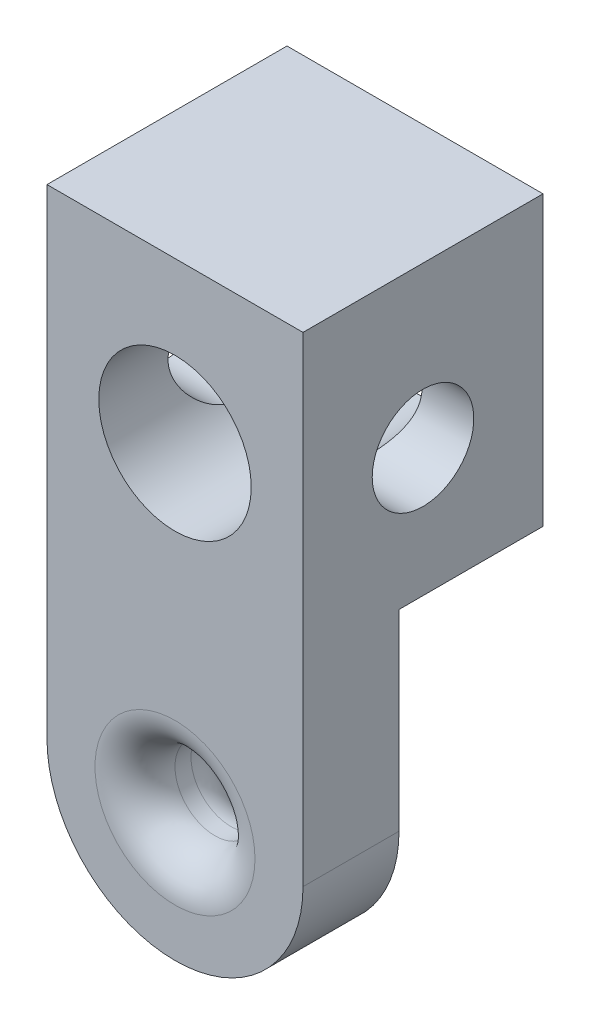
ISO-10303-21;
HEADER;
FILE_DESCRIPTION(('STEP AP214'),'2;1');
FILE_NAME('part.step','',(''),(''),'','','');
FILE_SCHEMA(('AUTOMOTIVE_DESIGN { 1 0 10303 214 1 1 1 1 }'));
ENDSEC;
DATA;
#1=APPLICATION_CONTEXT('core data for automotive mechanical design processes');
#2=APPLICATION_PROTOCOL_DEFINITION('international standard','automotive_design',2000,#1);
#3=PRODUCT_CONTEXT('',#1,'mechanical');
#4=PRODUCT('Part','Part','',(#3));
#5=PRODUCT_RELATED_PRODUCT_CATEGORY('part','',(#4));
#6=PRODUCT_DEFINITION_FORMATION('','',#4);
#7=PRODUCT_DEFINITION_CONTEXT('part definition',#1,'design');
#8=PRODUCT_DEFINITION('design','',#6,#7);
#9=PRODUCT_DEFINITION_SHAPE('','',#8);
#10=(LENGTH_UNIT() NAMED_UNIT(*) SI_UNIT(.MILLI.,.METRE.));
#11=(NAMED_UNIT(*) PLANE_ANGLE_UNIT() SI_UNIT($,.RADIAN.));
#12=(NAMED_UNIT(*) SI_UNIT($,.STERADIAN.) SOLID_ANGLE_UNIT());
#13=UNCERTAINTY_MEASURE_WITH_UNIT(LENGTH_MEASURE(1.E-05),#10,'distance_accuracy_value','');
#14=(GEOMETRIC_REPRESENTATION_CONTEXT(3) GLOBAL_UNCERTAINTY_ASSIGNED_CONTEXT((#13)) GLOBAL_UNIT_ASSIGNED_CONTEXT((#10,
#11,#12)) REPRESENTATION_CONTEXT('',''));
#15=CARTESIAN_POINT('',(0.,0.,0.));
#16=DIRECTION('',(0.,0.,1.));
#17=DIRECTION('',(1.,0.,0.));
#18=AXIS2_PLACEMENT_3D('',#15,#16,#17);
#19=CARTESIAN_POINT('',(0.,0.,0.));
#20=DIRECTION('',(0.,0.,1.));
#21=DIRECTION('',(1.,0.,0.));
#22=AXIS2_PLACEMENT_3D('',#19,#20,#21);
#23=PLANE('',#22);
#24=CARTESIAN_POINT('',(0.,20.,0.));
#25=DIRECTION('',(0.,0.,1.));
#26=DIRECTION('',(1.,0.,0.));
#27=AXIS2_PLACEMENT_3D('',#24,#25,#26);
#28=CIRCLE('',#27,4.7625);
#29=CARTESIAN_POINT('',(4.7625,20.,0.));
#30=VERTEX_POINT('',#29);
#31=EDGE_CURVE('E126',#30,#30,#28,.T.);
#32=ORIENTED_EDGE('',*,*,#31,.T.);
#33=EDGE_LOOP('',(#32));
#34=FACE_BOUND('',#33,.T.);
#35=DIRECTION('',(-1.,0.,0.));
#36=VECTOR('',#35,1.);
#37=CARTESIAN_POINT('',(8.,12.,0.));
#38=LINE('',#37,#36);
#39=CARTESIAN_POINT('',(8.,12.,0.));
#40=VERTEX_POINT('',#39);
#41=CARTESIAN_POINT('',(-8.,12.,0.));
#42=VERTEX_POINT('',#41);
#43=EDGE_CURVE('E118',#40,#42,#38,.T.);
#44=ORIENTED_EDGE('',*,*,#43,.T.);
#45=DIRECTION('',(0.,-1.,0.));
#46=VECTOR('',#45,1.);
#47=CARTESIAN_POINT('',(-8.,12.,0.));
#48=LINE('',#47,#46);
#49=CARTESIAN_POINT('',(-8.,30.,0.));
#50=VERTEX_POINT('',#49);
#51=EDGE_CURVE('E84',#50,#42,#48,.T.);
#52=ORIENTED_EDGE('',*,*,#51,.F.);
#53=DIRECTION('',(-1.,0.,0.));
#54=VECTOR('',#53,1.);
#55=CARTESIAN_POINT('',(8.,30.,0.));
#56=LINE('',#55,#54);
#57=CARTESIAN_POINT('',(8.,30.,0.));
#58=VERTEX_POINT('',#57);
#59=EDGE_CURVE('E143',#58,#50,#56,.T.);
#60=ORIENTED_EDGE('',*,*,#59,.F.);
#61=DIRECTION('',(0.,1.,0.));
#62=VECTOR('',#61,1.);
#63=CARTESIAN_POINT('',(8.,12.,0.));
#64=LINE('',#63,#62);
#65=EDGE_CURVE('E134',#40,#58,#64,.T.);
#66=ORIENTED_EDGE('',*,*,#65,.F.);
#67=EDGE_LOOP('',(#44,#52,#60,#66));
#68=FACE_BOUND('',#67,.T.);
#69=ADVANCED_FACE('F37',(#34,#68),#23,.F.);
#70=CARTESIAN_POINT('',(0.,0.,15.));
#71=DIRECTION('',(0.,0.,-1.));
#72=DIRECTION('',(-1.,0.,0.));
#73=AXIS2_PLACEMENT_3D('',#70,#71,#72);
#74=CYLINDRICAL_SURFACE('',#73,8.);
#75=CARTESIAN_POINT('',(0.,0.,9.));
#76=DIRECTION('',(0.,0.,-1.));
#77=DIRECTION('',(-1.,0.,0.));
#78=AXIS2_PLACEMENT_3D('',#75,#76,#77);
#79=CIRCLE('',#78,8.);
#80=CARTESIAN_POINT('',(8.,0.,9.));
#81=VERTEX_POINT('',#80);
#82=CARTESIAN_POINT('',(-8.,0.,9.));
#83=VERTEX_POINT('',#82);
#84=EDGE_CURVE('E59',#81,#83,#79,.T.);
#85=ORIENTED_EDGE('',*,*,#84,.F.);
#86=DIRECTION('',(0.,0.,-1.));
#87=VECTOR('',#86,1.);
#88=CARTESIAN_POINT('',(8.,0.,15.));
#89=LINE('',#88,#87);
#90=CARTESIAN_POINT('',(8.,0.,15.));
#91=VERTEX_POINT('',#90);
#92=EDGE_CURVE('E124',#91,#81,#89,.T.);
#93=ORIENTED_EDGE('',*,*,#92,.F.);
#94=CARTESIAN_POINT('',(0.,0.,15.));
#95=DIRECTION('',(0.,0.,1.));
#96=DIRECTION('',(1.,0.,0.));
#97=AXIS2_PLACEMENT_3D('',#94,#95,#96);
#98=CIRCLE('',#97,8.);
#99=CARTESIAN_POINT('',(-8.,0.,15.));
#100=VERTEX_POINT('',#99);
#101=EDGE_CURVE('E135',#100,#91,#98,.T.);
#102=ORIENTED_EDGE('',*,*,#101,.F.);
#103=DIRECTION('',(0.,0.,-1.));
#104=VECTOR('',#103,1.);
#105=CARTESIAN_POINT('',(-8.,0.,15.));
#106=LINE('',#105,#104);
#107=EDGE_CURVE('E141',#100,#83,#106,.T.);
#108=ORIENTED_EDGE('',*,*,#107,.T.);
#109=EDGE_LOOP('',(#85,#93,#102,#108));
#110=FACE_BOUND('',#109,.T.);
#111=ADVANCED_FACE('F184',(#110),#74,.T.);
#112=CARTESIAN_POINT('',(8.,12.,15.));
#113=DIRECTION('',(-1.,0.,0.));
#114=DIRECTION('',(0.,-1.,0.));
#115=AXIS2_PLACEMENT_3D('',#112,#113,#114);
#116=PLANE('',#115);
#117=CARTESIAN_POINT('',(8.00000000000001,20.,7.5));
#118=DIRECTION('',(-1.,0.,0.));
#119=DIRECTION('',(0.,0.,1.));
#120=AXIS2_PLACEMENT_3D('',#117,#118,#119);
#121=CIRCLE('',#120,3.175);
#122=CARTESIAN_POINT('',(8.00000000000001,20.,10.675));
#123=VERTEX_POINT('',#122);
#124=EDGE_CURVE('E167',#123,#123,#121,.T.);
#125=ORIENTED_EDGE('',*,*,#124,.T.);
#126=EDGE_LOOP('',(#125));
#127=FACE_BOUND('',#126,.T.);
#128=DIRECTION('',(0.,0.,-1.));
#129=VECTOR('',#128,1.);
#130=CARTESIAN_POINT('',(8.,12.,9.));
#131=LINE('',#130,#129);
#132=CARTESIAN_POINT('',(8.,12.,9.));
#133=VERTEX_POINT('',#132);
#134=EDGE_CURVE('E116',#133,#40,#131,.T.);
#135=ORIENTED_EDGE('',*,*,#134,.T.);
#136=ORIENTED_EDGE('',*,*,#65,.T.);
#137=DIRECTION('',(0.,0.,-1.));
#138=VECTOR('',#137,1.);
#139=CARTESIAN_POINT('',(8.,30.,15.));
#140=LINE('',#139,#138);
#141=CARTESIAN_POINT('',(8.,30.,15.));
#142=VERTEX_POINT('',#141);
#143=EDGE_CURVE('E151',#142,#58,#140,.T.);
#144=ORIENTED_EDGE('',*,*,#143,.F.);
#145=DIRECTION('',(0.,1.,0.));
#146=VECTOR('',#145,1.);
#147=CARTESIAN_POINT('',(8.,12.,15.));
#148=LINE('',#147,#146);
#149=EDGE_CURVE('E92',#91,#142,#148,.T.);
#150=ORIENTED_EDGE('',*,*,#149,.F.);
#151=ORIENTED_EDGE('',*,*,#92,.T.);
#152=DIRECTION('',(0.,1.,0.));
#153=VECTOR('',#152,1.);
#154=CARTESIAN_POINT('',(8.,12.,9.));
#155=LINE('',#154,#153);
#156=EDGE_CURVE('E110',#81,#133,#155,.T.);
#157=ORIENTED_EDGE('',*,*,#156,.T.);
#158=EDGE_LOOP('',(#135,#136,#144,#150,#151,#157));
#159=FACE_BOUND('',#158,.T.);
#160=ADVANCED_FACE('F122',(#127,#159),#116,.F.);
#161=CARTESIAN_POINT('',(-8.,12.,15.));
#162=DIRECTION('',(1.,0.,0.));
#163=DIRECTION('',(0.,1.,0.));
#164=AXIS2_PLACEMENT_3D('',#161,#162,#163);
#165=PLANE('',#164);
#166=CARTESIAN_POINT('',(-8.,20.,7.5));
#167=DIRECTION('',(-1.,0.,0.));
#168=DIRECTION('',(0.,0.,1.));
#169=AXIS2_PLACEMENT_3D('',#166,#167,#168);
#170=CIRCLE('',#169,3.17499999999999);
#171=CARTESIAN_POINT('',(-8.,20.,10.675));
#172=VERTEX_POINT('',#171);
#173=EDGE_CURVE('E325',#172,#172,#170,.T.);
#174=ORIENTED_EDGE('',*,*,#173,.F.);
#175=EDGE_LOOP('',(#174));
#176=FACE_BOUND('',#175,.T.);
#177=DIRECTION('',(0.,0.,-1.));
#178=VECTOR('',#177,1.);
#179=CARTESIAN_POINT('',(-8.,12.,9.));
#180=LINE('',#179,#178);
#181=CARTESIAN_POINT('',(-8.,12.,9.));
#182=VERTEX_POINT('',#181);
#183=EDGE_CURVE('E120',#182,#42,#180,.T.);
#184=ORIENTED_EDGE('',*,*,#183,.F.);
#185=DIRECTION('',(0.,-1.,0.));
#186=VECTOR('',#185,1.);
#187=CARTESIAN_POINT('',(-8.,12.,9.));
#188=LINE('',#187,#186);
#189=EDGE_CURVE('E111',#182,#83,#188,.T.);
#190=ORIENTED_EDGE('',*,*,#189,.T.);
#191=ORIENTED_EDGE('',*,*,#107,.F.);
#192=DIRECTION('',(0.,-1.,0.));
#193=VECTOR('',#192,1.);
#194=CARTESIAN_POINT('',(-8.,30.,15.));
#195=LINE('',#194,#193);
#196=CARTESIAN_POINT('',(-8.,30.,15.));
#197=VERTEX_POINT('',#196);
#198=EDGE_CURVE('E68',#197,#100,#195,.T.);
#199=ORIENTED_EDGE('',*,*,#198,.F.);
#200=DIRECTION('',(0.,0.,-1.));
#201=VECTOR('',#200,1.);
#202=CARTESIAN_POINT('',(-8.,30.,15.));
#203=LINE('',#202,#201);
#204=EDGE_CURVE('E148',#197,#50,#203,.T.);
#205=ORIENTED_EDGE('',*,*,#204,.T.);
#206=ORIENTED_EDGE('',*,*,#51,.T.);
#207=EDGE_LOOP('',(#184,#190,#191,#199,#205,#206));
#208=FACE_BOUND('',#207,.T.);
#209=ADVANCED_FACE('F197',(#176,#208),#165,.F.);
#210=CARTESIAN_POINT('',(0.,0.,15.));
#211=DIRECTION('',(0.,0.,-1.));
#212=DIRECTION('',(-1.,0.,0.));
#213=AXIS2_PLACEMENT_3D('',#210,#211,#212);
#214=CYLINDRICAL_SURFACE('',#213,2.5);
#215=CARTESIAN_POINT('',(0.,0.,12.5));
#216=DIRECTION('',(0.,0.,1.));
#217=DIRECTION('',(1.,0.,0.));
#218=AXIS2_PLACEMENT_3D('',#215,#216,#217);
#219=CIRCLE('',#218,2.5);
#220=CARTESIAN_POINT('',(2.5,0.,12.5));
#221=VERTEX_POINT('',#220);
#222=EDGE_CURVE('E158',#221,#221,#219,.T.);
#223=ORIENTED_EDGE('',*,*,#222,.T.);
#224=EDGE_LOOP('',(#223));
#225=FACE_BOUND('',#224,.T.);
#226=CARTESIAN_POINT('',(0.,0.,11.5));
#227=DIRECTION('',(0.,0.,-1.));
#228=DIRECTION('',(-1.,0.,0.));
#229=AXIS2_PLACEMENT_3D('',#226,#227,#228);
#230=CIRCLE('',#229,2.5);
#231=CARTESIAN_POINT('',(-2.5,0.,11.5));
#232=VERTEX_POINT('',#231);
#233=EDGE_CURVE('E155',#232,#232,#230,.T.);
#234=ORIENTED_EDGE('',*,*,#233,.T.);
#235=EDGE_LOOP('',(#234));
#236=FACE_BOUND('',#235,.T.);
#237=ADVANCED_FACE('F200',(#225,#236),#214,.F.);
#238=CARTESIAN_POINT('',(0.,0.,15.));
#239=DIRECTION('',(0.,0.,1.));
#240=DIRECTION('',(1.,0.,0.));
#241=AXIS2_PLACEMENT_3D('',#238,#239,#240);
#242=PLANE('',#241);
#243=CARTESIAN_POINT('',(0.,20.,15.));
#244=DIRECTION('',(0.,0.,1.));
#245=DIRECTION('',(1.,0.,0.));
#246=AXIS2_PLACEMENT_3D('',#243,#244,#245);
#247=CIRCLE('',#246,4.76249999999999);
#248=CARTESIAN_POINT('',(4.76249999999999,20.,15.));
#249=VERTEX_POINT('',#248);
#250=EDGE_CURVE('E321',#249,#249,#247,.T.);
#251=ORIENTED_EDGE('',*,*,#250,.F.);
#252=EDGE_LOOP('',(#251));
#253=FACE_BOUND('',#252,.T.);
#254=CARTESIAN_POINT('',(0.,0.,15.));
#255=DIRECTION('',(0.,0.,1.));
#256=DIRECTION('',(1.,0.,0.));
#257=AXIS2_PLACEMENT_3D('',#254,#255,#256);
#258=CIRCLE('',#257,5.);
#259=CARTESIAN_POINT('',(5.,0.,15.));
#260=VERTEX_POINT('',#259);
#261=EDGE_CURVE('E51',#260,#260,#258,.F.);
#262=ORIENTED_EDGE('',*,*,#261,.T.);
#263=EDGE_LOOP('',(#262));
#264=FACE_BOUND('',#263,.T.);
#265=ORIENTED_EDGE('',*,*,#101,.T.);
#266=ORIENTED_EDGE('',*,*,#149,.T.);
#267=DIRECTION('',(-1.,0.,0.));
#268=VECTOR('',#267,1.);
#269=CARTESIAN_POINT('',(8.,30.,15.));
#270=LINE('',#269,#268);
#271=EDGE_CURVE('E138',#142,#197,#270,.T.);
#272=ORIENTED_EDGE('',*,*,#271,.T.);
#273=ORIENTED_EDGE('',*,*,#198,.T.);
#274=EDGE_LOOP('',(#265,#266,#272,#273));
#275=FACE_BOUND('',#274,.T.);
#276=ADVANCED_FACE('F195',(#253,#264,#275),#242,.T.);
#277=CARTESIAN_POINT('',(8.,30.,15.));
#278=DIRECTION('',(0.,-1.,0.));
#279=DIRECTION('',(1.,0.,0.));
#280=AXIS2_PLACEMENT_3D('',#277,#278,#279);
#281=PLANE('',#280);
#282=ORIENTED_EDGE('',*,*,#59,.T.);
#283=ORIENTED_EDGE('',*,*,#204,.F.);
#284=ORIENTED_EDGE('',*,*,#271,.F.);
#285=ORIENTED_EDGE('',*,*,#143,.T.);
#286=EDGE_LOOP('',(#282,#283,#284,#285));
#287=FACE_BOUND('',#286,.T.);
#288=ADVANCED_FACE('F202',(#287),#281,.F.);
#289=CARTESIAN_POINT('',(0.,0.,9.));
#290=DIRECTION('',(0.,0.,-1.));
#291=DIRECTION('',(-1.,0.,0.));
#292=AXIS2_PLACEMENT_3D('',#289,#290,#291);
#293=PLANE('',#292);
#294=CARTESIAN_POINT('',(0.,0.,9.));
#295=DIRECTION('',(0.,0.,-1.));
#296=DIRECTION('',(-1.,0.,0.));
#297=AXIS2_PLACEMENT_3D('',#294,#295,#296);
#298=CIRCLE('',#297,5.);
#299=CARTESIAN_POINT('',(-5.,0.,9.));
#300=VERTEX_POINT('',#299);
#301=EDGE_CURVE('E11',#300,#300,#298,.F.);
#302=ORIENTED_EDGE('',*,*,#301,.T.);
#303=EDGE_LOOP('',(#302));
#304=FACE_BOUND('',#303,.T.);
#305=ORIENTED_EDGE('',*,*,#84,.T.);
#306=ORIENTED_EDGE('',*,*,#189,.F.);
#307=DIRECTION('',(-1.,0.,0.));
#308=VECTOR('',#307,1.);
#309=CARTESIAN_POINT('',(8.,12.,9.));
#310=LINE('',#309,#308);
#311=EDGE_CURVE('E106',#133,#182,#310,.T.);
#312=ORIENTED_EDGE('',*,*,#311,.F.);
#313=ORIENTED_EDGE('',*,*,#156,.F.);
#314=EDGE_LOOP('',(#305,#306,#312,#313));
#315=FACE_BOUND('',#314,.T.);
#316=ADVANCED_FACE('F108',(#304,#315),#293,.T.);
#317=CARTESIAN_POINT('',(8.,12.,9.));
#318=DIRECTION('',(0.,-1.,0.));
#319=DIRECTION('',(1.,0.,0.));
#320=AXIS2_PLACEMENT_3D('',#317,#318,#319);
#321=PLANE('',#320);
#322=ORIENTED_EDGE('',*,*,#43,.F.);
#323=ORIENTED_EDGE('',*,*,#134,.F.);
#324=ORIENTED_EDGE('',*,*,#311,.T.);
#325=ORIENTED_EDGE('',*,*,#183,.T.);
#326=EDGE_LOOP('',(#322,#323,#324,#325));
#327=FACE_BOUND('',#326,.T.);
#328=ADVANCED_FACE('F117',(#327),#321,.T.);
#329=CARTESIAN_POINT('',(0.,0.,12.5));
#330=DIRECTION('',(0.,0.,1.));
#331=DIRECTION('',(1.,0.,0.));
#332=AXIS2_PLACEMENT_3D('',#329,#330,#331);
#333=TOROIDAL_SURFACE('',#332,5.,2.5);
#334=ORIENTED_EDGE('',*,*,#261,.F.);
#335=EDGE_LOOP('',(#334));
#336=FACE_BOUND('',#335,.T.);
#337=ORIENTED_EDGE('',*,*,#222,.F.);
#338=EDGE_LOOP('',(#337));
#339=FACE_BOUND('',#338,.T.);
#340=ADVANCED_FACE('F208',(#336,#339),#333,.T.);
#341=CARTESIAN_POINT('',(0.,0.,11.5));
#342=DIRECTION('',(0.,0.,-1.));
#343=DIRECTION('',(-1.,0.,0.));
#344=AXIS2_PLACEMENT_3D('',#341,#342,#343);
#345=TOROIDAL_SURFACE('',#344,5.,2.5);
#346=ORIENTED_EDGE('',*,*,#301,.F.);
#347=EDGE_LOOP('',(#346));
#348=FACE_BOUND('',#347,.T.);
#349=ORIENTED_EDGE('',*,*,#233,.F.);
#350=EDGE_LOOP('',(#349));
#351=FACE_BOUND('',#350,.T.);
#352=ADVANCED_FACE('F39',(#348,#351),#345,.T.);
#353=CARTESIAN_POINT('',(0.,20.,15.));
#354=DIRECTION('',(0.,0.,1.));
#355=DIRECTION('',(1.,0.,0.));
#356=AXIS2_PLACEMENT_3D('',#353,#354,#355);
#357=CYLINDRICAL_SURFACE('',#356,4.76249999999999);
#358=CARTESIAN_POINT('',(4.76249999999999,20.,4.32500000000001));
#359=CARTESIAN_POINT('',(4.76249829558771,20.1595135061465,4.32500214612327));
#360=CARTESIAN_POINT('',(4.75441585981928,20.3190368229406,4.33708798621757));
#361=CARTESIAN_POINT('',(4.72288699141972,20.6329903332693,4.38468421247041));
#362=CARTESIAN_POINT('',(4.69943326470019,20.7874180722565,4.42020571953271));
#363=CARTESIAN_POINT('',(4.63947623936464,21.0861866118583,4.51249621667314));
#364=CARTESIAN_POINT('',(4.60303407934685,21.2305709456459,4.56916571764626));
#365=CARTESIAN_POINT('',(4.52002748417047,21.5071968891728,4.70133803130145));
#366=CARTESIAN_POINT('',(4.47346157948094,21.6394367320879,4.77684357839963));
#367=CARTESIAN_POINT('',(4.36923384005693,21.9006894278574,4.95151790553974));
#368=CARTESIAN_POINT('',(4.31096574538351,22.0284762255929,5.05215098363579));
#369=CARTESIAN_POINT('',(4.19071922389352,22.2665182802891,5.27072144753205));
#370=CARTESIAN_POINT('',(4.12873555797056,22.3767479406785,5.38868362477028));
#371=CARTESIAN_POINT('',(3.99618620055342,22.5943289736193,5.66017063514477));
#372=CARTESIAN_POINT('',(3.92580920318786,22.6984830826904,5.81636997487356));
#373=CARTESIAN_POINT('',(3.79546083955007,22.8789369184169,6.14802686160152));
#374=CARTESIAN_POINT('',(3.73547157335728,22.9552848158306,6.32345041238712));
#375=CARTESIAN_POINT('',(3.65087323287846,23.0587003056751,6.63752917837351));
#376=CARTESIAN_POINT('',(3.62104984276854,23.0936318498349,6.77217641895692));
#377=CARTESIAN_POINT('',(3.57597026836952,23.1456410573772,7.04715690125781));
#378=CARTESIAN_POINT('',(3.56068897885194,23.1627494951155,7.18747990609092));
#379=CARTESIAN_POINT('',(3.54705611398895,23.1780379057263,7.47059121144639));
#380=CARTESIAN_POINT('',(3.54877374048434,23.17614050629,7.61338722475806));
#381=CARTESIAN_POINT('',(3.56901393593137,23.1533716036927,7.89629552040347));
#382=CARTESIAN_POINT('',(3.58755074204361,23.1324840256258,8.03640542637181));
#383=CARTESIAN_POINT('',(3.63739407712628,23.0744317831127,8.3040164439586));
#384=CARTESIAN_POINT('',(3.66810112544891,23.0380259194241,8.43180112117995));
#385=CARTESIAN_POINT('',(3.73871526235138,22.9506881321986,8.67955010979676));
#386=CARTESIAN_POINT('',(3.77862537744388,22.8997514287527,8.79951183185715));
#387=CARTESIAN_POINT('',(3.87293161809883,22.7729468724944,9.05420281498847));
#388=CARTESIAN_POINT('',(3.92862304429405,22.6941153303002,9.18697259197917));
#389=CARTESIAN_POINT('',(4.04322816135651,22.518869746926,9.43894614005392));
#390=CARTESIAN_POINT('',(4.10214576296336,22.4224340203599,9.55813288170832));
#391=CARTESIAN_POINT('',(4.23137558230652,22.1904509995025,9.80591129113202));
#392=CARTESIAN_POINT('',(4.30140657245415,22.0509537702559,9.93099280228032));
#393=CARTESIAN_POINT('',(4.43258734804498,21.7494376985367,10.1561994350834));
#394=CARTESIAN_POINT('',(4.49374542015899,21.5874401502074,10.2563479058376));
#395=CARTESIAN_POINT('',(4.59018328993748,21.2777118005163,10.4106458783131));
#396=CARTESIAN_POINT('',(4.62818577100373,21.133407758853,10.4699638393004));
#397=CARTESIAN_POINT('',(4.69118503960837,20.8350822197474,10.5672165694305));
#398=CARTESIAN_POINT('',(4.71619281752453,20.6810690579151,10.6051694105724));
#399=CARTESIAN_POINT('',(4.75100462923953,20.366689406911,10.6577933498153));
#400=CARTESIAN_POINT('',(4.76074299407138,20.2062985014455,10.6723638942395));
#401=CARTESIAN_POINT('',(4.76381945007164,19.8849990879694,10.6769797530925));
#402=CARTESIAN_POINT('',(4.75715868774694,19.7240906169288,10.6670267820259));
#403=CARTESIAN_POINT('',(4.72915598211032,19.4182515489382,10.6247968117954));
#404=CARTESIAN_POINT('',(4.70887816144477,19.2729925565716,10.5941370398137));
#405=CARTESIAN_POINT('',(4.65643038239683,18.9901652270217,10.5137168484544));
#406=CARTESIAN_POINT('',(4.62425852748367,18.8525981203565,10.463953382901));
#407=CARTESIAN_POINT('',(4.54812959640012,18.5797197086346,10.3437644784417));
#408=CARTESIAN_POINT('',(4.50357668840462,18.4450498068951,10.272270055397));
#409=CARTESIAN_POINT('',(4.40692945783368,18.1891656994704,10.1123371522084));
#410=CARTESIAN_POINT('',(4.35483048266613,18.0679598772407,10.023888207648));
#411=CARTESIAN_POINT('',(4.23790342811905,17.822181052957,9.81678500930825));
#412=CARTESIAN_POINT('',(4.17236523918598,17.7001063972886,9.69556606216408));
#413=CARTESIAN_POINT('',(4.0413173727562,17.4769232569421,9.43498560490975));
#414=CARTESIAN_POINT('',(3.97580774594568,17.3758292633589,9.29561166279184));
#415=CARTESIAN_POINT('',(3.85666740360082,17.2040191721264,9.012661419845));
#416=CARTESIAN_POINT('',(3.8025006025781,17.1314567759613,8.8704378972891));
#417=CARTESIAN_POINT('',(3.70584371667972,17.0076226074221,8.5733521638361));
#418=CARTESIAN_POINT('',(3.66333266217137,16.9563125143358,8.41851330891839));
#419=CARTESIAN_POINT('',(3.60256467927561,16.8847559833142,8.12775387782635));
#420=CARTESIAN_POINT('',(3.58132059145466,16.8605822579132,7.99343975609327));
#421=CARTESIAN_POINT('',(3.55408653184002,16.8297751116833,7.72133991164025));
#422=CARTESIAN_POINT('',(3.54807999179148,16.8231226391554,7.58355812425447));
#423=CARTESIAN_POINT('',(3.55225668535638,16.82779521735,7.30847916327206));
#424=CARTESIAN_POINT('',(3.56244950530631,16.8391309129704,7.17118232484976));
#425=CARTESIAN_POINT('',(3.59744096141944,16.8790227482538,6.90096708934583));
#426=CARTESIAN_POINT('',(3.6222590824651,16.907601862058,6.76805478357152));
#427=CARTESIAN_POINT('',(3.69136350740653,16.9902101843884,6.47493377101032));
#428=CARTESIAN_POINT('',(3.7390752101256,17.0489917085228,6.31688867807124));
#429=CARTESIAN_POINT('',(3.84527739400296,17.1887847189899,6.01491347639415));
#430=CARTESIAN_POINT('',(3.90378297026142,17.2698274158703,5.8710035728833));
#431=CARTESIAN_POINT('',(4.02617059026332,17.4536712676265,5.59614450366364));
#432=CARTESIAN_POINT('',(4.09013111420676,17.5568416274972,5.46547893626395));
#433=CARTESIAN_POINT('',(4.21685775015533,17.7827333924087,5.22140861594258));
#434=CARTESIAN_POINT('',(4.27962348959933,17.9054607875026,5.10800917227569));
#435=CARTESIAN_POINT('',(4.37333498138707,18.1126149339892,4.94508141501688));
#436=CARTESIAN_POINT('',(4.40641312548885,18.1909865563569,4.88897238013268));
#437=CARTESIAN_POINT('',(4.46961905722943,18.3533401806512,4.78366220114295));
#438=CARTESIAN_POINT('',(4.49974819878213,18.437319577923,4.73445788247665));
#439=CARTESIAN_POINT('',(4.55616827072524,18.6103928488661,4.64357643775622));
#440=CARTESIAN_POINT('',(4.58246276002165,18.6994818719382,4.60189232363784));
#441=CARTESIAN_POINT('',(4.63042056995049,18.882170399019,4.52664327179394));
#442=CARTESIAN_POINT('',(4.65208551661339,18.9757683051754,4.49307548283162));
#443=CARTESIAN_POINT('',(4.70058109652365,19.2197646071726,4.41845860015883));
#444=CARTESIAN_POINT('',(4.72362103868263,19.3728959036819,4.38357234310823));
#445=CARTESIAN_POINT('',(4.75457565287333,19.6840174193135,4.33685063903056));
#446=CARTESIAN_POINT('',(4.76250168819872,19.8420038972148,4.32499787429217));
#447=CARTESIAN_POINT('',(4.76249999999999,20.,4.32500000000001));
#448=B_SPLINE_CURVE_WITH_KNOTS('',3,(#358,#359,#360,#361,#362,#363,#364,#365,#366,#367,#368,
#369,#370,#371,#372,#373,#374,#375,#376,#377,#378,#379,#380,#381,#382,#383,#384,#385,#386,#387,
#388,#389,#390,#391,#392,#393,#394,#395,#396,#397,#398,#399,#400,#401,#402,#403,#404,#405,#406,
#407,#408,#409,#410,#411,#412,#413,#414,#415,#416,#417,#418,#419,#420,#421,#422,#423,#424,#425,
#426,#427,#428,#429,#430,#431,#432,#433,#434,#435,#436,#437,#438,#439,#440,#441,#442,#443,#444,
#445,#446,#447),.UNSPECIFIED.,.T.,.F.,(4,2,2,2,2,2,2,2,2,2,2,2,2,2,2,2,2,2,2,2,2,2,2,2,2,2,2,2,
2,2,2,2,2,2,2,2,2,2,2,2,2,2,2,2,4),(0.,0.477921997077322,0.95607094527854,1.43199826818948,
1.90799472139475,2.42438283538383,2.94151703421855,3.54023109732371,4.13790297394633,
4.56300988710695,4.98738156455221,5.41348154879911,5.8399425565557,6.24758818745147,
6.65536806800919,7.14609274784493,7.63742604761196,8.2346634027395,8.83133933988769,
9.3110698922896,9.79039404549572,10.2717740223998,10.7531203456965,11.2006552211841,
11.6482614879236,12.1229810060221,12.5979944723587,13.1481222963465,13.6986288317687,
14.2025677230621,14.705593948025,15.1181442623597,15.5302458053914,15.9425913096207,
16.3554874162604,16.8784049132826,17.4020593249785,17.9352455177247,18.4685953331297,
18.7739424593008,19.0791487337134,19.3840699212457,19.6888838348844,20.1626158186784,
20.6359914894769),.UNSPECIFIED.);
#449=CARTESIAN_POINT('',(4.76249999999999,20.,4.32500000000001));
#450=VERTEX_POINT('',#449);
#451=EDGE_CURVE('E41',#450,#450,#448,.T.);
#452=ORIENTED_EDGE('',*,*,#451,.T.);
#453=EDGE_LOOP('',(#452));
#454=FACE_BOUND('',#453,.T.);
#455=CARTESIAN_POINT('',(-4.76249999999999,20.,10.675));
#456=CARTESIAN_POINT('',(-4.76249829558771,20.1595135061465,10.6749978538767));
#457=CARTESIAN_POINT('',(-4.75441585981928,20.3190368229406,10.6629120137824));
#458=CARTESIAN_POINT('',(-4.72288699141972,20.6329903332693,10.6153157875296));
#459=CARTESIAN_POINT('',(-4.69943326470019,20.7874180722565,10.5797942804673));
#460=CARTESIAN_POINT('',(-4.63947623936464,21.0861866118583,10.4875037833269));
#461=CARTESIAN_POINT('',(-4.60303407934684,21.2305709456459,10.4308342823537));
#462=CARTESIAN_POINT('',(-4.52002748417046,21.5071968891728,10.2986619686985));
#463=CARTESIAN_POINT('',(-4.47346157948093,21.6394367320879,10.2231564216004));
#464=CARTESIAN_POINT('',(-4.36923384005693,21.9006894278574,10.0484820944603));
#465=CARTESIAN_POINT('',(-4.31096574538351,22.0284762255929,9.94784901636421));
#466=CARTESIAN_POINT('',(-4.19071922389352,22.2665182802891,9.72927855246795));
#467=CARTESIAN_POINT('',(-4.12873555797056,22.3767479406785,9.61131637522972));
#468=CARTESIAN_POINT('',(-3.99618620055342,22.5943289736193,9.33982936485523));
#469=CARTESIAN_POINT('',(-3.92580920318786,22.6984830826904,9.18363002512645));
#470=CARTESIAN_POINT('',(-3.79546083955007,22.8789369184169,8.85197313839848));
#471=CARTESIAN_POINT('',(-3.73547157335728,22.9552848158306,8.67654958761289));
#472=CARTESIAN_POINT('',(-3.65087323287846,23.0587003056751,8.36247082162649));
#473=CARTESIAN_POINT('',(-3.62104984276854,23.0936318498349,8.22782358104309));
#474=CARTESIAN_POINT('',(-3.57597026836952,23.1456410573772,7.95284309874219));
#475=CARTESIAN_POINT('',(-3.56068897885194,23.1627494951155,7.81252009390908));
#476=CARTESIAN_POINT('',(-3.54705611398894,23.1780379057263,7.52940878855361));
#477=CARTESIAN_POINT('',(-3.54877374048434,23.17614050629,7.38661277524195));
#478=CARTESIAN_POINT('',(-3.56901393593137,23.1533716036927,7.10370447959654));
#479=CARTESIAN_POINT('',(-3.58755074204361,23.1324840256258,6.9635945736282));
#480=CARTESIAN_POINT('',(-3.63739407712628,23.0744317831127,6.6959835560414));
#481=CARTESIAN_POINT('',(-3.66810112544891,23.0380259194241,6.56819887882005));
#482=CARTESIAN_POINT('',(-3.73871526235138,22.9506881321986,6.32044989020324));
#483=CARTESIAN_POINT('',(-3.77862537744388,22.8997514287527,6.20048816814286));
#484=CARTESIAN_POINT('',(-3.87293161809883,22.7729468724944,5.94579718501153));
#485=CARTESIAN_POINT('',(-3.92862304429404,22.6941153303002,5.81302740802083));
#486=CARTESIAN_POINT('',(-4.04322816135651,22.518869746926,5.56105385994609));
#487=CARTESIAN_POINT('',(-4.10214576296336,22.4224340203599,5.44186711829169));
#488=CARTESIAN_POINT('',(-4.23137558230651,22.1904509995025,5.19408870886799));
#489=CARTESIAN_POINT('',(-4.30140657245415,22.0509537702559,5.06900719771969));
#490=CARTESIAN_POINT('',(-4.43258734804497,21.7494376985367,4.8438005649166));
#491=CARTESIAN_POINT('',(-4.49374542015899,21.5874401502074,4.7436520941624));
#492=CARTESIAN_POINT('',(-4.59018328993747,21.2777118005163,4.58935412168689));
#493=CARTESIAN_POINT('',(-4.62818577100372,21.1334077588531,4.53003616069963));
#494=CARTESIAN_POINT('',(-4.69118503960837,20.8350822197474,4.43278343056955));
#495=CARTESIAN_POINT('',(-4.71619281752453,20.6810690579151,4.39483058942757));
#496=CARTESIAN_POINT('',(-4.75100462923953,20.366689406911,4.34220665018474));
#497=CARTESIAN_POINT('',(-4.76074299407138,20.2062985014455,4.32763610576052));
#498=CARTESIAN_POINT('',(-4.76381945007164,19.8849990879694,4.3230202469075));
#499=CARTESIAN_POINT('',(-4.75715868774694,19.7240906169288,4.33297321797412));
#500=CARTESIAN_POINT('',(-4.72915598211032,19.4182515489382,4.37520318820458));
#501=CARTESIAN_POINT('',(-4.70887816144477,19.2729925565716,4.4058629601863));
#502=CARTESIAN_POINT('',(-4.65643038239684,18.9901652270217,4.48628315154555));
#503=CARTESIAN_POINT('',(-4.62425852748367,18.8525981203565,4.53604661709901));
#504=CARTESIAN_POINT('',(-4.54812959640012,18.5797197086346,4.65623552155832));
#505=CARTESIAN_POINT('',(-4.50357668840463,18.4450498068951,4.72772994460303));
#506=CARTESIAN_POINT('',(-4.40692945783368,18.1891656994704,4.88766284779163));
#507=CARTESIAN_POINT('',(-4.35483048266614,18.0679598772407,4.976111792352));
#508=CARTESIAN_POINT('',(-4.23790342811905,17.822181052957,5.18321499069174));
#509=CARTESIAN_POINT('',(-4.17236523918599,17.7001063972886,5.30443393783591));
#510=CARTESIAN_POINT('',(-4.04131737275621,17.4769232569422,5.56501439509023));
#511=CARTESIAN_POINT('',(-3.97580774594569,17.3758292633589,5.70438833720815));
#512=CARTESIAN_POINT('',(-3.85666740360082,17.2040191721264,5.98733858015499));
#513=CARTESIAN_POINT('',(-3.8025006025781,17.1314567759613,6.12956210271089));
#514=CARTESIAN_POINT('',(-3.70584371667973,17.0076226074221,6.42664783616389));
#515=CARTESIAN_POINT('',(-3.66333266217137,16.9563125143358,6.5814866910816));
#516=CARTESIAN_POINT('',(-3.60256467927561,16.8847559833142,6.87224612217364));
#517=CARTESIAN_POINT('',(-3.58132059145466,16.8605822579132,7.00656024390672));
#518=CARTESIAN_POINT('',(-3.55408653184002,16.8297751116833,7.27866008835974));
#519=CARTESIAN_POINT('',(-3.54807999179147,16.8231226391554,7.41644187574552));
#520=CARTESIAN_POINT('',(-3.55225668535638,16.82779521735,7.69152083672794));
#521=CARTESIAN_POINT('',(-3.56244950530631,16.8391309129704,7.82881767515023));
#522=CARTESIAN_POINT('',(-3.59744096141944,16.8790227482538,8.09903291065416));
#523=CARTESIAN_POINT('',(-3.62225908246509,16.907601862058,8.23194521642847));
#524=CARTESIAN_POINT('',(-3.69136350740652,16.9902101843884,8.52506622898967));
#525=CARTESIAN_POINT('',(-3.73907521012559,17.0489917085228,8.68311132192875));
#526=CARTESIAN_POINT('',(-3.84527739400296,17.1887847189899,8.98508652360584));
#527=CARTESIAN_POINT('',(-3.90378297026141,17.2698274158703,9.12899642711669));
#528=CARTESIAN_POINT('',(-4.02617059026331,17.4536712676265,9.40385549633635));
#529=CARTESIAN_POINT('',(-4.09013111420676,17.5568416274972,9.53452106373605));
#530=CARTESIAN_POINT('',(-4.21685775015532,17.7827333924087,9.77859138405741));
#531=CARTESIAN_POINT('',(-4.27962348959932,17.9054607875026,9.8919908277243));
#532=CARTESIAN_POINT('',(-4.37333498138707,18.1126149339892,10.0549185849831));
#533=CARTESIAN_POINT('',(-4.40641312548885,18.1909865563569,10.1110276198673));
#534=CARTESIAN_POINT('',(-4.46961905722943,18.3533401806512,10.216337798857));
#535=CARTESIAN_POINT('',(-4.49974819878213,18.437319577923,10.2655421175234));
#536=CARTESIAN_POINT('',(-4.55616827072524,18.6103928488661,10.3564235622438));
#537=CARTESIAN_POINT('',(-4.58246276002165,18.6994818719382,10.3981076763622));
#538=CARTESIAN_POINT('',(-4.63042056995048,18.882170399019,10.4733567282061));
#539=CARTESIAN_POINT('',(-4.65208551661338,18.9757683051754,10.5069245171684));
#540=CARTESIAN_POINT('',(-4.70058109652365,19.2197646071726,10.5815413998412));
#541=CARTESIAN_POINT('',(-4.72362103868263,19.3728959036819,10.6164276568918));
#542=CARTESIAN_POINT('',(-4.75457565287333,19.6840174193135,10.6631493609694));
#543=CARTESIAN_POINT('',(-4.76250168819872,19.8420038972148,10.6750021257078));
#544=CARTESIAN_POINT('',(-4.76249999999999,20.,10.675));
#545=B_SPLINE_CURVE_WITH_KNOTS('',3,(#455,#456,#457,#458,#459,#460,#461,#462,#463,#464,#465,
#466,#467,#468,#469,#470,#471,#472,#473,#474,#475,#476,#477,#478,#479,#480,#481,#482,#483,#484,
#485,#486,#487,#488,#489,#490,#491,#492,#493,#494,#495,#496,#497,#498,#499,#500,#501,#502,#503,
#504,#505,#506,#507,#508,#509,#510,#511,#512,#513,#514,#515,#516,#517,#518,#519,#520,#521,#522,
#523,#524,#525,#526,#527,#528,#529,#530,#531,#532,#533,#534,#535,#536,#537,#538,#539,#540,#541,
#542,#543,#544),.UNSPECIFIED.,.T.,.F.,(4,2,2,2,2,2,2,2,2,2,2,2,2,2,2,2,2,2,2,2,2,2,2,2,2,2,2,2,
2,2,2,2,2,2,2,2,2,2,2,2,2,2,2,2,4),(0.,0.477921997077322,0.95607094527854,1.43199826818949,
1.90799472139475,2.42438283538383,2.94151703421855,3.54023109732371,4.13790297394633,
4.56300988710695,4.9873815645522,5.41348154879911,5.8399425565557,6.24758818745147,
6.65536806800918,7.14609274784493,7.63742604761196,8.23466340273949,8.83133933988768,
9.31106989228958,9.79039404549571,10.2717740223998,10.7531203456965,11.200655221184,
11.6482614879236,12.1229810060221,12.5979944723586,13.1481222963465,13.6986288317687,
14.2025677230621,14.705593948025,15.1181442623597,15.5302458053914,15.9425913096207,
16.3554874162604,16.8784049132826,17.4020593249785,17.9352455177247,18.4685953331297,
18.7739424593008,19.0791487337134,19.3840699212457,19.6888838348844,20.1626158186784,
20.6359914894769),.UNSPECIFIED.);
#546=CARTESIAN_POINT('',(-4.76249999999999,20.,10.675));
#547=VERTEX_POINT('',#546);
#548=EDGE_CURVE('E162',#547,#547,#545,.T.);
#549=ORIENTED_EDGE('',*,*,#548,.T.);
#550=EDGE_LOOP('',(#549));
#551=FACE_BOUND('',#550,.T.);
#552=ORIENTED_EDGE('',*,*,#31,.F.);
#553=EDGE_LOOP('',(#552));
#554=FACE_BOUND('',#553,.T.);
#555=ORIENTED_EDGE('',*,*,#250,.T.);
#556=EDGE_LOOP('',(#555));
#557=FACE_BOUND('',#556,.T.);
#558=ADVANCED_FACE('F168',(#454,#551,#554,#557),#357,.F.);
#559=CARTESIAN_POINT('',(-7.99999999999999,20.,7.5));
#560=DIRECTION('',(-1.,0.,0.));
#561=DIRECTION('',(0.,0.,1.));
#562=AXIS2_PLACEMENT_3D('',#559,#560,#561);
#563=CYLINDRICAL_SURFACE('',#562,3.17499999999999);
#564=ORIENTED_EDGE('',*,*,#173,.T.);
#565=EDGE_LOOP('',(#564));
#566=FACE_BOUND('',#565,.T.);
#567=ORIENTED_EDGE('',*,*,#548,.F.);
#568=EDGE_LOOP('',(#567));
#569=FACE_BOUND('',#568,.T.);
#570=ADVANCED_FACE('F174',(#566,#569),#563,.F.);
#571=ORIENTED_EDGE('',*,*,#124,.F.);
#572=EDGE_LOOP('',(#571));
#573=FACE_BOUND('',#572,.T.);
#574=ORIENTED_EDGE('',*,*,#451,.F.);
#575=EDGE_LOOP('',(#574));
#576=FACE_BOUND('',#575,.T.);
#577=ADVANCED_FACE('F171',(#573,#576),#563,.F.);
#578=CLOSED_SHELL('',(#69,#111,#160,#209,#237,#276,#288,#316,#328,#340,#352,#558,#570,#577));
#579=MANIFOLD_SOLID_BREP('B2',#578);
#580=ADVANCED_BREP_SHAPE_REPRESENTATION('',(#18,#579),#14);
#581=SHAPE_DEFINITION_REPRESENTATION(#9,#580);
ENDSEC;
END-ISO-10303-21;
